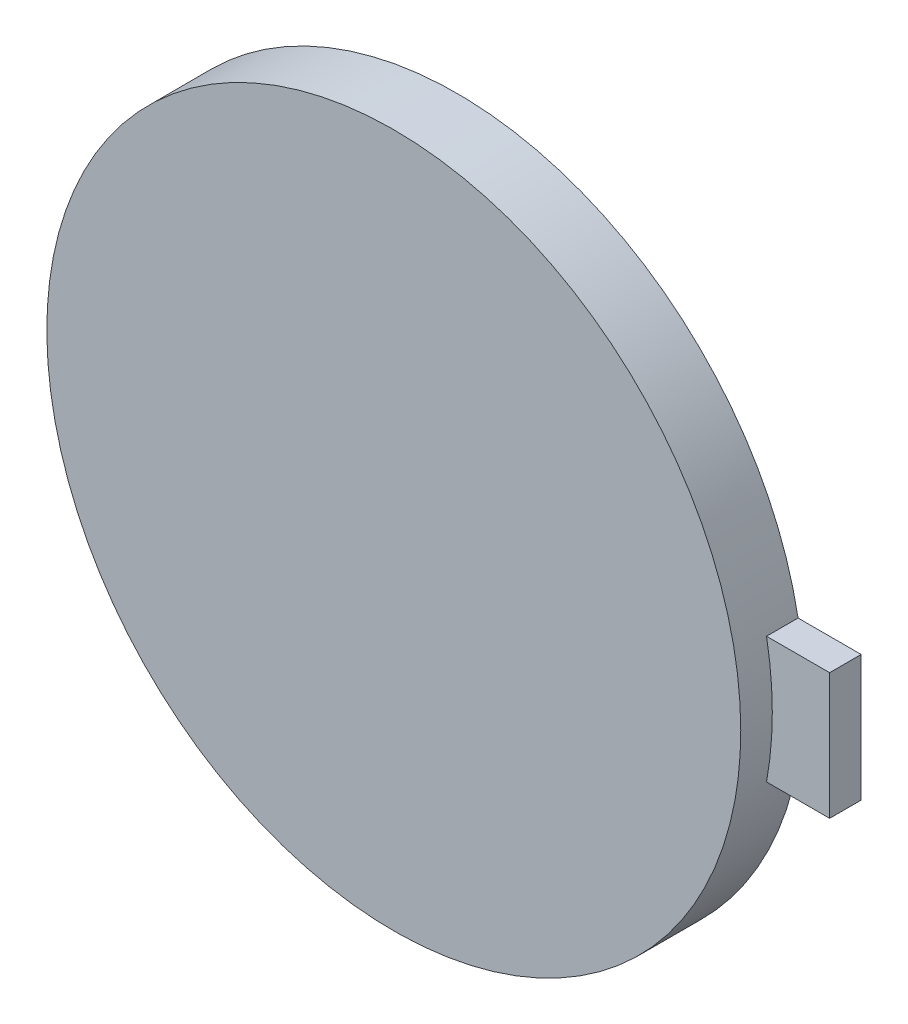
ISO-10303-21;
HEADER;
FILE_DESCRIPTION(('STEP AP214'),'2;1');
FILE_NAME('part.step','',(''),(''),'','','');
FILE_SCHEMA(('AUTOMOTIVE_DESIGN { 1 0 10303 214 1 1 1 1 }'));
ENDSEC;
DATA;
#1=APPLICATION_CONTEXT('core data for automotive mechanical design processes');
#2=APPLICATION_PROTOCOL_DEFINITION('international standard','automotive_design',2000,#1);
#3=PRODUCT_CONTEXT('',#1,'mechanical');
#4=PRODUCT('Part','Part','',(#3));
#5=PRODUCT_RELATED_PRODUCT_CATEGORY('part','',(#4));
#6=PRODUCT_DEFINITION_FORMATION('','',#4);
#7=PRODUCT_DEFINITION_CONTEXT('part definition',#1,'design');
#8=PRODUCT_DEFINITION('design','',#6,#7);
#9=PRODUCT_DEFINITION_SHAPE('','',#8);
#10=(LENGTH_UNIT() NAMED_UNIT(*) SI_UNIT(.MILLI.,.METRE.));
#11=(NAMED_UNIT(*) PLANE_ANGLE_UNIT() SI_UNIT($,.RADIAN.));
#12=(NAMED_UNIT(*) SI_UNIT($,.STERADIAN.) SOLID_ANGLE_UNIT());
#13=UNCERTAINTY_MEASURE_WITH_UNIT(LENGTH_MEASURE(1.E-05),#10,'distance_accuracy_value','');
#14=(GEOMETRIC_REPRESENTATION_CONTEXT(3) GLOBAL_UNCERTAINTY_ASSIGNED_CONTEXT((#13)) GLOBAL_UNIT_ASSIGNED_CONTEXT((#10,
#11,#12)) REPRESENTATION_CONTEXT('',''));
#15=CARTESIAN_POINT('',(0.,0.,0.));
#16=DIRECTION('',(0.,0.,1.));
#17=DIRECTION('',(1.,0.,0.));
#18=AXIS2_PLACEMENT_3D('',#15,#16,#17);
#19=CARTESIAN_POINT('',(0.,0.,5.));
#20=DIRECTION('',(0.,0.,-1.));
#21=DIRECTION('',(-1.,0.,0.));
#22=AXIS2_PLACEMENT_3D('',#19,#20,#21);
#23=CYLINDRICAL_SURFACE('',#22,55.);
#24=DIRECTION('',(0.,0.,-1.));
#25=VECTOR('',#24,1.);
#26=CARTESIAN_POINT('',(54.0832691319598,-10.,10.));
#27=LINE('',#26,#25);
#28=CARTESIAN_POINT('',(54.0832691319598,-10.,5.));
#29=VERTEX_POINT('',#28);
#30=CARTESIAN_POINT('',(54.0832691319598,-10.,0.));
#31=VERTEX_POINT('',#30);
#32=EDGE_CURVE('E62',#29,#31,#27,.T.);
#33=ORIENTED_EDGE('',*,*,#32,.F.);
#34=CARTESIAN_POINT('',(0.,0.,5.));
#35=DIRECTION('',(0.,0.,-1.));
#36=DIRECTION('',(-1.,0.,0.));
#37=AXIS2_PLACEMENT_3D('',#34,#35,#36);
#38=CIRCLE('',#37,55.);
#39=CARTESIAN_POINT('',(54.0832691319598,10.,5.));
#40=VERTEX_POINT('',#39);
#41=EDGE_CURVE('E79',#40,#29,#38,.T.);
#42=ORIENTED_EDGE('',*,*,#41,.F.);
#43=DIRECTION('',(0.,0.,-1.));
#44=VECTOR('',#43,1.);
#45=CARTESIAN_POINT('',(54.0832691319598,10.,10.));
#46=LINE('',#45,#44);
#47=CARTESIAN_POINT('',(54.0832691319598,10.,0.));
#48=VERTEX_POINT('',#47);
#49=EDGE_CURVE('E209',#40,#48,#46,.T.);
#50=ORIENTED_EDGE('',*,*,#49,.T.);
#51=CARTESIAN_POINT('',(0.,0.,0.));
#52=DIRECTION('',(0.,0.,1.));
#53=DIRECTION('',(1.,0.,0.));
#54=AXIS2_PLACEMENT_3D('',#51,#52,#53);
#55=CIRCLE('',#54,55.);
#56=EDGE_CURVE('E11',#48,#31,#55,.T.);
#57=ORIENTED_EDGE('',*,*,#56,.T.);
#58=EDGE_LOOP('',(#33,#42,#50,#57));
#59=FACE_BOUND('',#58,.T.);
#60=CARTESIAN_POINT('',(0.,0.,10.));
#61=DIRECTION('',(0.,0.,1.));
#62=DIRECTION('',(1.,0.,0.));
#63=AXIS2_PLACEMENT_3D('',#60,#61,#62);
#64=CIRCLE('',#63,55.);
#65=CARTESIAN_POINT('',(55.,0.,10.));
#66=VERTEX_POINT('',#65);
#67=EDGE_CURVE('E96',#66,#66,#64,.T.);
#68=ORIENTED_EDGE('',*,*,#67,.F.);
#69=EDGE_LOOP('',(#68));
#70=FACE_BOUND('',#69,.T.);
#71=ADVANCED_FACE('F39',(#59,#70),#23,.T.);
#72=CARTESIAN_POINT('',(0.,0.,0.));
#73=DIRECTION('',(0.,0.,1.));
#74=DIRECTION('',(1.,0.,0.));
#75=AXIS2_PLACEMENT_3D('',#72,#73,#74);
#76=PLANE('',#75);
#77=DIRECTION('',(1.,0.,0.));
#78=VECTOR('',#77,1.);
#79=CARTESIAN_POINT('',(54.0832691319598,-10.,0.));
#80=LINE('',#79,#78);
#81=CARTESIAN_POINT('',(64.0832691319598,-10.,0.));
#82=VERTEX_POINT('',#81);
#83=EDGE_CURVE('E223',#31,#82,#80,.T.);
#84=ORIENTED_EDGE('',*,*,#83,.F.);
#85=ORIENTED_EDGE('',*,*,#56,.F.);
#86=DIRECTION('',(-1.,0.,0.));
#87=VECTOR('',#86,1.);
#88=CARTESIAN_POINT('',(54.0832691319598,10.,0.));
#89=LINE('',#88,#87);
#90=CARTESIAN_POINT('',(64.0832691319598,10.,0.));
#91=VERTEX_POINT('',#90);
#92=EDGE_CURVE('E212',#91,#48,#89,.T.);
#93=ORIENTED_EDGE('',*,*,#92,.F.);
#94=DIRECTION('',(0.,1.,0.));
#95=VECTOR('',#94,1.);
#96=CARTESIAN_POINT('',(64.0832691319598,10.,0.));
#97=LINE('',#96,#95);
#98=EDGE_CURVE('E217',#82,#91,#97,.T.);
#99=ORIENTED_EDGE('',*,*,#98,.F.);
#100=EDGE_LOOP('',(#84,#85,#93,#99));
#101=FACE_BOUND('',#100,.T.);
#102=CARTESIAN_POINT('',(0.,0.,0.));
#103=DIRECTION('',(0.,0.,1.));
#104=DIRECTION('',(1.,0.,0.));
#105=AXIS2_PLACEMENT_3D('',#102,#103,#104);
#106=CIRCLE('',#105,50.);
#107=CARTESIAN_POINT('',(50.,0.,0.));
#108=VERTEX_POINT('',#107);
#109=EDGE_CURVE('E47',#108,#108,#106,.T.);
#110=ORIENTED_EDGE('',*,*,#109,.T.);
#111=EDGE_LOOP('',(#110));
#112=FACE_BOUND('',#111,.T.);
#113=ADVANCED_FACE('F113',(#101,#112),#76,.F.);
#114=CARTESIAN_POINT('',(0.,0.,5.));
#115=DIRECTION('',(0.,0.,-1.));
#116=DIRECTION('',(-1.,0.,0.));
#117=AXIS2_PLACEMENT_3D('',#114,#115,#116);
#118=CYLINDRICAL_SURFACE('',#117,50.);
#119=CARTESIAN_POINT('',(0.,0.,5.));
#120=DIRECTION('',(0.,0.,1.));
#121=DIRECTION('',(1.,0.,0.));
#122=AXIS2_PLACEMENT_3D('',#119,#120,#121);
#123=CIRCLE('',#122,50.);
#124=CARTESIAN_POINT('',(50.,0.,5.));
#125=VERTEX_POINT('',#124);
#126=EDGE_CURVE('E101',#125,#125,#123,.T.);
#127=ORIENTED_EDGE('',*,*,#126,.T.);
#128=EDGE_LOOP('',(#127));
#129=FACE_BOUND('',#128,.T.);
#130=ORIENTED_EDGE('',*,*,#109,.F.);
#131=EDGE_LOOP('',(#130));
#132=FACE_BOUND('',#131,.T.);
#133=ADVANCED_FACE('F115',(#129,#132),#118,.F.);
#134=CARTESIAN_POINT('',(0.,0.,5.));
#135=DIRECTION('',(0.,0.,1.));
#136=DIRECTION('',(1.,0.,0.));
#137=AXIS2_PLACEMENT_3D('',#134,#135,#136);
#138=PLANE('',#137);
#139=ORIENTED_EDGE('',*,*,#126,.F.);
#140=EDGE_LOOP('',(#139));
#141=FACE_BOUND('',#140,.T.);
#142=ADVANCED_FACE('F117',(#141),#138,.F.);
#143=CARTESIAN_POINT('',(0.,0.,10.));
#144=DIRECTION('',(0.,0.,1.));
#145=DIRECTION('',(1.,0.,0.));
#146=AXIS2_PLACEMENT_3D('',#143,#144,#145);
#147=PLANE('',#146);
#148=ORIENTED_EDGE('',*,*,#67,.T.);
#149=EDGE_LOOP('',(#148));
#150=FACE_BOUND('',#149,.T.);
#151=ADVANCED_FACE('F124',(#150),#147,.T.);
#152=CARTESIAN_POINT('',(54.0832691319598,-10.,10.));
#153=DIRECTION('',(0.,1.,0.));
#154=DIRECTION('',(0.,0.,1.));
#155=AXIS2_PLACEMENT_3D('',#152,#153,#154);
#156=PLANE('',#155);
#157=DIRECTION('',(0.,0.,-1.));
#158=VECTOR('',#157,1.);
#159=CARTESIAN_POINT('',(64.0832691319598,-10.,10.));
#160=LINE('',#159,#158);
#161=CARTESIAN_POINT('',(64.0832691319598,-10.,5.));
#162=VERTEX_POINT('',#161);
#163=EDGE_CURVE('E89',#162,#82,#160,.T.);
#164=ORIENTED_EDGE('',*,*,#163,.F.);
#165=DIRECTION('',(1.,0.,0.));
#166=VECTOR('',#165,1.);
#167=CARTESIAN_POINT('',(64.0832691319598,-10.,5.));
#168=LINE('',#167,#166);
#169=EDGE_CURVE('E81',#29,#162,#168,.T.);
#170=ORIENTED_EDGE('',*,*,#169,.F.);
#171=ORIENTED_EDGE('',*,*,#32,.T.);
#172=ORIENTED_EDGE('',*,*,#83,.T.);
#173=EDGE_LOOP('',(#164,#170,#171,#172));
#174=FACE_BOUND('',#173,.T.);
#175=ADVANCED_FACE('F88',(#174),#156,.F.);
#176=CARTESIAN_POINT('',(64.0832691319598,10.,10.));
#177=DIRECTION('',(-1.,0.,0.));
#178=DIRECTION('',(0.,0.,1.));
#179=AXIS2_PLACEMENT_3D('',#176,#177,#178);
#180=PLANE('',#179);
#181=DIRECTION('',(0.,0.,-1.));
#182=VECTOR('',#181,1.);
#183=CARTESIAN_POINT('',(64.0832691319598,10.,10.));
#184=LINE('',#183,#182);
#185=CARTESIAN_POINT('',(64.0832691319598,10.,5.));
#186=VERTEX_POINT('',#185);
#187=EDGE_CURVE('E103',#186,#91,#184,.T.);
#188=ORIENTED_EDGE('',*,*,#187,.F.);
#189=DIRECTION('',(0.,1.,0.));
#190=VECTOR('',#189,1.);
#191=CARTESIAN_POINT('',(64.0832691319598,10.,5.));
#192=LINE('',#191,#190);
#193=EDGE_CURVE('E54',#162,#186,#192,.T.);
#194=ORIENTED_EDGE('',*,*,#193,.F.);
#195=ORIENTED_EDGE('',*,*,#163,.T.);
#196=ORIENTED_EDGE('',*,*,#98,.T.);
#197=EDGE_LOOP('',(#188,#194,#195,#196));
#198=FACE_BOUND('',#197,.T.);
#199=ADVANCED_FACE('F165',(#198),#180,.F.);
#200=CARTESIAN_POINT('',(54.0832691319598,10.,10.));
#201=DIRECTION('',(0.,-1.,0.));
#202=DIRECTION('',(0.,0.,-1.));
#203=AXIS2_PLACEMENT_3D('',#200,#201,#202);
#204=PLANE('',#203);
#205=ORIENTED_EDGE('',*,*,#49,.F.);
#206=DIRECTION('',(-1.,0.,0.));
#207=VECTOR('',#206,1.);
#208=CARTESIAN_POINT('',(54.0832691319598,10.,5.));
#209=LINE('',#208,#207);
#210=EDGE_CURVE('E82',#186,#40,#209,.T.);
#211=ORIENTED_EDGE('',*,*,#210,.F.);
#212=ORIENTED_EDGE('',*,*,#187,.T.);
#213=ORIENTED_EDGE('',*,*,#92,.T.);
#214=EDGE_LOOP('',(#205,#211,#212,#213));
#215=FACE_BOUND('',#214,.T.);
#216=ADVANCED_FACE('F172',(#215),#204,.F.);
#217=CARTESIAN_POINT('',(0.,0.,5.));
#218=DIRECTION('',(0.,0.,-1.));
#219=DIRECTION('',(-1.,0.,0.));
#220=AXIS2_PLACEMENT_3D('',#217,#218,#219);
#221=PLANE('',#220);
#222=ORIENTED_EDGE('',*,*,#41,.T.);
#223=ORIENTED_EDGE('',*,*,#169,.T.);
#224=ORIENTED_EDGE('',*,*,#193,.T.);
#225=ORIENTED_EDGE('',*,*,#210,.T.);
#226=EDGE_LOOP('',(#222,#223,#224,#225));
#227=FACE_BOUND('',#226,.T.);
#228=ADVANCED_FACE('F80',(#227),#221,.F.);
#229=CLOSED_SHELL('',(#71,#113,#133,#142,#151,#175,#199,#216,#228));
#230=MANIFOLD_SOLID_BREP('B2',#229);
#231=ADVANCED_BREP_SHAPE_REPRESENTATION('',(#18,#230),#14);
#232=SHAPE_DEFINITION_REPRESENTATION(#9,#231);
ENDSEC;
END-ISO-10303-21;
